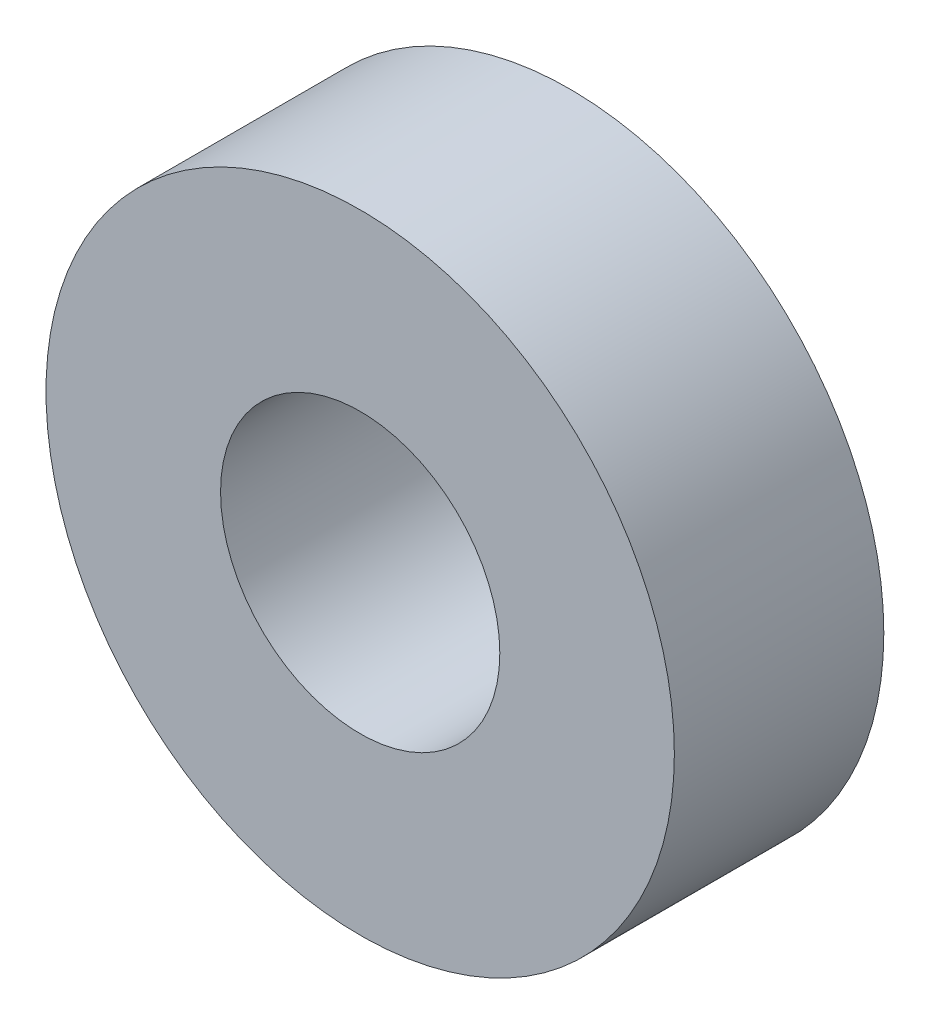
ISO-10303-21;
HEADER;
FILE_DESCRIPTION(('STEP AP214'),'2;1');
FILE_NAME('part.step','',(''),(''),'','','');
FILE_SCHEMA(('AUTOMOTIVE_DESIGN { 1 0 10303 214 1 1 1 1 }'));
ENDSEC;
DATA;
#1=APPLICATION_CONTEXT('core data for automotive mechanical design processes');
#2=APPLICATION_PROTOCOL_DEFINITION('international standard','automotive_design',2000,#1);
#3=PRODUCT_CONTEXT('',#1,'mechanical');
#4=PRODUCT('Part','Part','',(#3));
#5=PRODUCT_RELATED_PRODUCT_CATEGORY('part','',(#4));
#6=PRODUCT_DEFINITION_FORMATION('','',#4);
#7=PRODUCT_DEFINITION_CONTEXT('part definition',#1,'design');
#8=PRODUCT_DEFINITION('design','',#6,#7);
#9=PRODUCT_DEFINITION_SHAPE('','',#8);
#10=(LENGTH_UNIT() NAMED_UNIT(*) SI_UNIT(.MILLI.,.METRE.));
#11=(NAMED_UNIT(*) PLANE_ANGLE_UNIT() SI_UNIT($,.RADIAN.));
#12=(NAMED_UNIT(*) SI_UNIT($,.STERADIAN.) SOLID_ANGLE_UNIT());
#13=UNCERTAINTY_MEASURE_WITH_UNIT(LENGTH_MEASURE(1.E-05),#10,'distance_accuracy_value','');
#14=(GEOMETRIC_REPRESENTATION_CONTEXT(3) GLOBAL_UNCERTAINTY_ASSIGNED_CONTEXT((#13)) GLOBAL_UNIT_ASSIGNED_CONTEXT((#10,
#11,#12)) REPRESENTATION_CONTEXT('',''));
#15=CARTESIAN_POINT('',(0.,0.,0.));
#16=DIRECTION('',(0.,0.,1.));
#17=DIRECTION('',(1.,0.,0.));
#18=AXIS2_PLACEMENT_3D('',#15,#16,#17);
#19=CARTESIAN_POINT('',(0.,0.,3.));
#20=DIRECTION('',(0.,0.,1.));
#21=DIRECTION('',(1.,0.,0.));
#22=AXIS2_PLACEMENT_3D('',#19,#20,#21);
#23=PLANE('',#22);
#24=CARTESIAN_POINT('',(0.,0.,3.));
#25=DIRECTION('',(0.,0.,1.));
#26=DIRECTION('',(1.,0.,0.));
#27=AXIS2_PLACEMENT_3D('',#24,#25,#26);
#28=CIRCLE('',#27,4.5);
#29=CARTESIAN_POINT('',(4.5,0.,3.));
#30=VERTEX_POINT('',#29);
#31=EDGE_CURVE('E10',#30,#30,#28,.T.);
#32=ORIENTED_EDGE('',*,*,#31,.T.);
#33=EDGE_LOOP('',(#32));
#34=FACE_BOUND('',#33,.T.);
#35=CARTESIAN_POINT('',(0.,0.,3.));
#36=DIRECTION('',(0.,0.,1.));
#37=DIRECTION('',(1.,0.,0.));
#38=AXIS2_PLACEMENT_3D('',#35,#36,#37);
#39=CIRCLE('',#38,2.);
#40=CARTESIAN_POINT('',(2.,0.,3.));
#41=VERTEX_POINT('',#40);
#42=EDGE_CURVE('E41',#41,#41,#39,.T.);
#43=ORIENTED_EDGE('',*,*,#42,.F.);
#44=EDGE_LOOP('',(#43));
#45=FACE_BOUND('',#44,.T.);
#46=ADVANCED_FACE('F30',(#34,#45),#23,.T.);
#47=CARTESIAN_POINT('',(0.,0.,0.));
#48=DIRECTION('',(0.,0.,1.));
#49=DIRECTION('',(1.,0.,0.));
#50=AXIS2_PLACEMENT_3D('',#47,#48,#49);
#51=PLANE('',#50);
#52=CARTESIAN_POINT('',(0.,0.,0.));
#53=DIRECTION('',(0.,0.,1.));
#54=DIRECTION('',(1.,0.,0.));
#55=AXIS2_PLACEMENT_3D('',#52,#53,#54);
#56=CIRCLE('',#55,4.5);
#57=CARTESIAN_POINT('',(4.5,0.,0.));
#58=VERTEX_POINT('',#57);
#59=EDGE_CURVE('E34',#58,#58,#56,.T.);
#60=ORIENTED_EDGE('',*,*,#59,.F.);
#61=EDGE_LOOP('',(#60));
#62=FACE_BOUND('',#61,.T.);
#63=CARTESIAN_POINT('',(0.,0.,0.));
#64=DIRECTION('',(0.,0.,1.));
#65=DIRECTION('',(1.,0.,0.));
#66=AXIS2_PLACEMENT_3D('',#63,#64,#65);
#67=CIRCLE('',#66,2.);
#68=CARTESIAN_POINT('',(2.,0.,0.));
#69=VERTEX_POINT('',#68);
#70=EDGE_CURVE('E43',#69,#69,#67,.T.);
#71=ORIENTED_EDGE('',*,*,#70,.T.);
#72=EDGE_LOOP('',(#71));
#73=FACE_BOUND('',#72,.T.);
#74=ADVANCED_FACE('F53',(#62,#73),#51,.F.);
#75=CARTESIAN_POINT('',(0.,0.,3.));
#76=DIRECTION('',(0.,0.,-1.));
#77=DIRECTION('',(-1.,0.,0.));
#78=AXIS2_PLACEMENT_3D('',#75,#76,#77);
#79=CYLINDRICAL_SURFACE('',#78,4.5);
#80=ORIENTED_EDGE('',*,*,#31,.F.);
#81=EDGE_LOOP('',(#80));
#82=FACE_BOUND('',#81,.T.);
#83=ORIENTED_EDGE('',*,*,#59,.T.);
#84=EDGE_LOOP('',(#83));
#85=FACE_BOUND('',#84,.T.);
#86=ADVANCED_FACE('F32',(#82,#85),#79,.T.);
#87=CARTESIAN_POINT('',(0.,0.,3.));
#88=DIRECTION('',(0.,0.,-1.));
#89=DIRECTION('',(-1.,0.,0.));
#90=AXIS2_PLACEMENT_3D('',#87,#88,#89);
#91=CYLINDRICAL_SURFACE('',#90,2.);
#92=ORIENTED_EDGE('',*,*,#42,.T.);
#93=EDGE_LOOP('',(#92));
#94=FACE_BOUND('',#93,.T.);
#95=ORIENTED_EDGE('',*,*,#70,.F.);
#96=EDGE_LOOP('',(#95));
#97=FACE_BOUND('',#96,.T.);
#98=ADVANCED_FACE('F49',(#94,#97),#91,.F.);
#99=CLOSED_SHELL('',(#46,#74,#86,#98));
#100=MANIFOLD_SOLID_BREP('B2',#99);
#101=ADVANCED_BREP_SHAPE_REPRESENTATION('',(#18,#100),#14);
#102=SHAPE_DEFINITION_REPRESENTATION(#9,#101);
ENDSEC;
END-ISO-10303-21;
